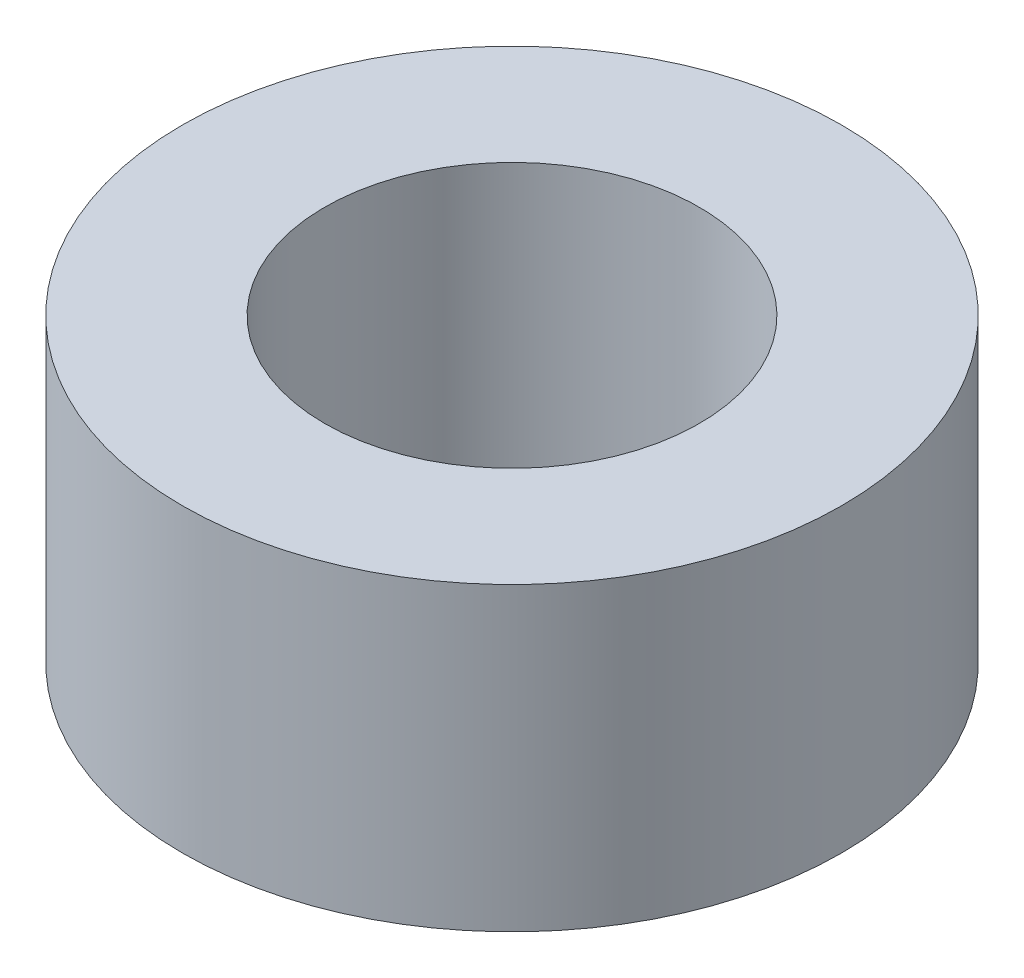
ISO-10303-21;
HEADER;
FILE_DESCRIPTION(('STEP AP214'),'2;1');
FILE_NAME('part.step','',(''),(''),'','','');
FILE_SCHEMA(('AUTOMOTIVE_DESIGN { 1 0 10303 214 1 1 1 1 }'));
ENDSEC;
DATA;
#1=APPLICATION_CONTEXT('core data for automotive mechanical design processes');
#2=APPLICATION_PROTOCOL_DEFINITION('international standard','automotive_design',2000,#1);
#3=PRODUCT_CONTEXT('',#1,'mechanical');
#4=PRODUCT('Part','Part','',(#3));
#5=PRODUCT_RELATED_PRODUCT_CATEGORY('part','',(#4));
#6=PRODUCT_DEFINITION_FORMATION('','',#4);
#7=PRODUCT_DEFINITION_CONTEXT('part definition',#1,'design');
#8=PRODUCT_DEFINITION('design','',#6,#7);
#9=PRODUCT_DEFINITION_SHAPE('','',#8);
#10=(LENGTH_UNIT() NAMED_UNIT(*) SI_UNIT(.MILLI.,.METRE.));
#11=(NAMED_UNIT(*) PLANE_ANGLE_UNIT() SI_UNIT($,.RADIAN.));
#12=(NAMED_UNIT(*) SI_UNIT($,.STERADIAN.) SOLID_ANGLE_UNIT());
#13=UNCERTAINTY_MEASURE_WITH_UNIT(LENGTH_MEASURE(1.E-05),#10,'distance_accuracy_value','');
#14=(GEOMETRIC_REPRESENTATION_CONTEXT(3) GLOBAL_UNCERTAINTY_ASSIGNED_CONTEXT((#13)) GLOBAL_UNIT_ASSIGNED_CONTEXT((#10,
#11,#12)) REPRESENTATION_CONTEXT('',''));
#15=CARTESIAN_POINT('',(0.,0.,0.));
#16=DIRECTION('',(0.,0.,1.));
#17=DIRECTION('',(1.,0.,0.));
#18=AXIS2_PLACEMENT_3D('',#15,#16,#17);
#19=CARTESIAN_POINT('',(0.,5.0165,0.));
#20=DIRECTION('',(0.,-1.,0.));
#21=DIRECTION('',(0.,0.,-1.));
#22=AXIS2_PLACEMENT_3D('',#19,#20,#21);
#23=CYLINDRICAL_SURFACE('',#22,3.125);
#24=CARTESIAN_POINT('',(0.,5.0165,0.));
#25=DIRECTION('',(0.,1.,0.));
#26=DIRECTION('',(0.,0.,1.));
#27=AXIS2_PLACEMENT_3D('',#24,#25,#26);
#28=CIRCLE('',#27,3.125);
#29=CARTESIAN_POINT('',(0.,5.0165,3.125));
#30=VERTEX_POINT('',#29);
#31=EDGE_CURVE('E53',#30,#30,#28,.T.);
#32=ORIENTED_EDGE('',*,*,#31,.T.);
#33=EDGE_LOOP('',(#32));
#34=FACE_BOUND('',#33,.T.);
#35=CARTESIAN_POINT('',(0.,0.,0.));
#36=DIRECTION('',(0.,1.,0.));
#37=DIRECTION('',(0.,0.,1.));
#38=AXIS2_PLACEMENT_3D('',#35,#36,#37);
#39=CIRCLE('',#38,3.125);
#40=CARTESIAN_POINT('',(0.,0.,3.125));
#41=VERTEX_POINT('',#40);
#42=EDGE_CURVE('E61',#41,#41,#39,.T.);
#43=ORIENTED_EDGE('',*,*,#42,.F.);
#44=EDGE_LOOP('',(#43));
#45=FACE_BOUND('',#44,.T.);
#46=ADVANCED_FACE('F45',(#34,#45),#23,.F.);
#47=CARTESIAN_POINT('',(0.,5.0165,0.));
#48=DIRECTION('',(0.,-1.,0.));
#49=DIRECTION('',(0.,0.,-1.));
#50=AXIS2_PLACEMENT_3D('',#47,#48,#49);
#51=CYLINDRICAL_SURFACE('',#50,5.4991);
#52=CARTESIAN_POINT('',(0.,5.0165,0.));
#53=DIRECTION('',(0.,1.,0.));
#54=DIRECTION('',(0.,0.,1.));
#55=AXIS2_PLACEMENT_3D('',#52,#53,#54);
#56=CIRCLE('',#55,5.4991);
#57=CARTESIAN_POINT('',(0.,5.0165,5.4991));
#58=VERTEX_POINT('',#57);
#59=EDGE_CURVE('E10',#58,#58,#56,.T.);
#60=ORIENTED_EDGE('',*,*,#59,.F.);
#61=EDGE_LOOP('',(#60));
#62=FACE_BOUND('',#61,.T.);
#63=CARTESIAN_POINT('',(0.,0.,0.));
#64=DIRECTION('',(0.,1.,0.));
#65=DIRECTION('',(0.,0.,1.));
#66=AXIS2_PLACEMENT_3D('',#63,#64,#65);
#67=CIRCLE('',#66,5.4991);
#68=CARTESIAN_POINT('',(0.,0.,5.4991));
#69=VERTEX_POINT('',#68);
#70=EDGE_CURVE('E48',#69,#69,#67,.T.);
#71=ORIENTED_EDGE('',*,*,#70,.T.);
#72=EDGE_LOOP('',(#71));
#73=FACE_BOUND('',#72,.T.);
#74=ADVANCED_FACE('F69',(#62,#73),#51,.T.);
#75=CARTESIAN_POINT('',(0.,5.0165,0.));
#76=DIRECTION('',(0.,1.,0.));
#77=DIRECTION('',(0.,0.,1.));
#78=AXIS2_PLACEMENT_3D('',#75,#76,#77);
#79=PLANE('',#78);
#80=ORIENTED_EDGE('',*,*,#31,.F.);
#81=EDGE_LOOP('',(#80));
#82=FACE_BOUND('',#81,.T.);
#83=ORIENTED_EDGE('',*,*,#59,.T.);
#84=EDGE_LOOP('',(#83));
#85=FACE_BOUND('',#84,.T.);
#86=ADVANCED_FACE('F73',(#82,#85),#79,.T.);
#87=CARTESIAN_POINT('',(0.,0.,0.));
#88=DIRECTION('',(0.,1.,0.));
#89=DIRECTION('',(0.,0.,1.));
#90=AXIS2_PLACEMENT_3D('',#87,#88,#89);
#91=PLANE('',#90);
#92=ORIENTED_EDGE('',*,*,#42,.T.);
#93=EDGE_LOOP('',(#92));
#94=FACE_BOUND('',#93,.T.);
#95=ORIENTED_EDGE('',*,*,#70,.F.);
#96=EDGE_LOOP('',(#95));
#97=FACE_BOUND('',#96,.T.);
#98=ADVANCED_FACE('F71',(#94,#97),#91,.F.);
#99=CLOSED_SHELL('',(#46,#74,#86,#98));
#100=MANIFOLD_SOLID_BREP('B2',#99);
#101=ADVANCED_BREP_SHAPE_REPRESENTATION('',(#18,#100),#14);
#102=SHAPE_DEFINITION_REPRESENTATION(#9,#101);
ENDSEC;
END-ISO-10303-21;
